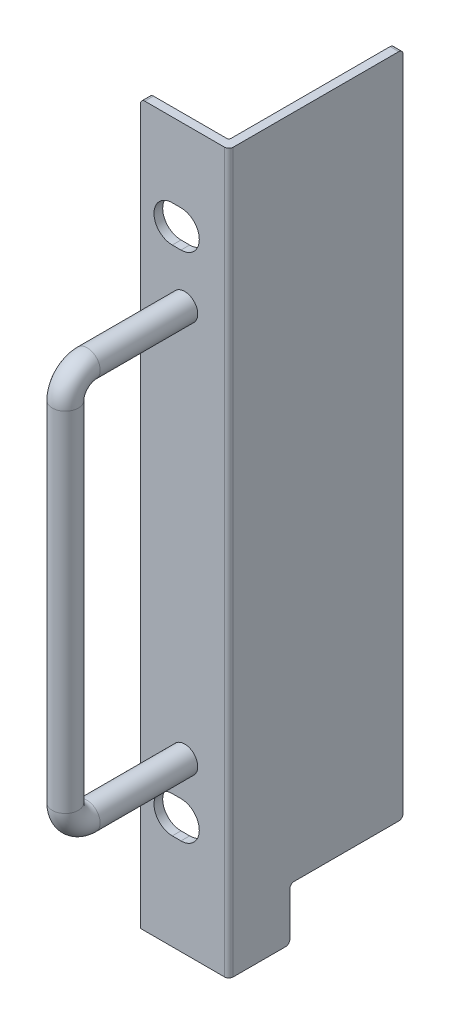
ISO-10303-21;
HEADER;
FILE_DESCRIPTION(('STEP AP214'),'2;1');
FILE_NAME('part.step','',(''),(''),'','','');
FILE_SCHEMA(('AUTOMOTIVE_DESIGN { 1 0 10303 214 1 1 1 1 }'));
ENDSEC;
DATA;
#1=APPLICATION_CONTEXT('core data for automotive mechanical design processes');
#2=APPLICATION_PROTOCOL_DEFINITION('international standard','automotive_design',2000,#1);
#3=PRODUCT_CONTEXT('',#1,'mechanical');
#4=PRODUCT('Part','Part','',(#3));
#5=PRODUCT_RELATED_PRODUCT_CATEGORY('part','',(#4));
#6=PRODUCT_DEFINITION_FORMATION('','',#4);
#7=PRODUCT_DEFINITION_CONTEXT('part definition',#1,'design');
#8=PRODUCT_DEFINITION('design','',#6,#7);
#9=PRODUCT_DEFINITION_SHAPE('','',#8);
#10=(LENGTH_UNIT() NAMED_UNIT(*) SI_UNIT(.MILLI.,.METRE.));
#11=(NAMED_UNIT(*) PLANE_ANGLE_UNIT() SI_UNIT($,.RADIAN.));
#12=(NAMED_UNIT(*) SI_UNIT($,.STERADIAN.) SOLID_ANGLE_UNIT());
#13=UNCERTAINTY_MEASURE_WITH_UNIT(LENGTH_MEASURE(1.E-05),#10,'distance_accuracy_value','');
#14=(GEOMETRIC_REPRESENTATION_CONTEXT(3) GLOBAL_UNCERTAINTY_ASSIGNED_CONTEXT((#13)) GLOBAL_UNIT_ASSIGNED_CONTEXT((#10,
#11,#12)) REPRESENTATION_CONTEXT('',''));
#15=CARTESIAN_POINT('',(0.,0.,0.));
#16=DIRECTION('',(0.,0.,1.));
#17=DIRECTION('',(1.,0.,0.));
#18=AXIS2_PLACEMENT_3D('',#15,#16,#17);
#19=CARTESIAN_POINT('',(0.,165.,0.));
#20=DIRECTION('',(0.,0.,-1.));
#21=DIRECTION('',(1.,0.,0.));
#22=AXIS2_PLACEMENT_3D('',#19,#20,#21);
#23=PLANE('',#22);
#24=CARTESIAN_POINT('',(-10.15,128.745,0.));
#25=DIRECTION('',(0.,0.,-1.));
#26=DIRECTION('',(-1.,0.,0.));
#27=AXIS2_PLACEMENT_3D('',#24,#25,#26);
#28=CIRCLE('',#27,3.);
#29=CARTESIAN_POINT('',(-13.15,128.745,0.));
#30=VERTEX_POINT('',#29);
#31=EDGE_CURVE('E307',#30,#30,#28,.T.);
#32=ORIENTED_EDGE('',*,*,#31,.T.);
#33=EDGE_LOOP('',(#32));
#34=FACE_BOUND('',#33,.T.);
#35=DIRECTION('',(1.,0.,0.));
#36=VECTOR('',#35,1.);
#37=CARTESIAN_POINT('',(-13.,147.945,0.));
#38=LINE('',#37,#36);
#39=CARTESIAN_POINT('',(-13.,147.945,0.));
#40=VERTEX_POINT('',#39);
#41=CARTESIAN_POINT('',(-11.,147.945,0.));
#42=VERTEX_POINT('',#41);
#43=EDGE_CURVE('E196',#40,#42,#38,.T.);
#44=ORIENTED_EDGE('',*,*,#43,.T.);
#45=CARTESIAN_POINT('',(-11.,143.745,0.));
#46=DIRECTION('',(0.,0.,-1.));
#47=DIRECTION('',(-1.,0.,0.));
#48=AXIS2_PLACEMENT_3D('',#45,#46,#47);
#49=CIRCLE('',#48,4.19999999999998);
#50=CARTESIAN_POINT('',(-11.,139.545,0.));
#51=VERTEX_POINT('',#50);
#52=EDGE_CURVE('E206',#42,#51,#49,.T.);
#53=ORIENTED_EDGE('',*,*,#52,.T.);
#54=DIRECTION('',(-1.,0.,0.));
#55=VECTOR('',#54,1.);
#56=CARTESIAN_POINT('',(-13.,139.545,0.));
#57=LINE('',#56,#55);
#58=CARTESIAN_POINT('',(-13.,139.545,0.));
#59=VERTEX_POINT('',#58);
#60=EDGE_CURVE('E211',#51,#59,#57,.T.);
#61=ORIENTED_EDGE('',*,*,#60,.T.);
#62=CARTESIAN_POINT('',(-13.,143.745,0.));
#63=DIRECTION('',(0.,0.,-1.));
#64=DIRECTION('',(-1.,0.,0.));
#65=AXIS2_PLACEMENT_3D('',#62,#63,#64);
#66=CIRCLE('',#65,4.19999999999998);
#67=EDGE_CURVE('E216',#59,#40,#66,.T.);
#68=ORIENTED_EDGE('',*,*,#67,.T.);
#69=EDGE_LOOP('',(#44,#53,#61,#68));
#70=FACE_BOUND('',#69,.T.);
#71=DIRECTION('',(1.,0.,0.));
#72=VECTOR('',#71,1.);
#73=CARTESIAN_POINT('',(-13.,30.455,0.));
#74=LINE('',#73,#72);
#75=CARTESIAN_POINT('',(-13.,30.455,0.));
#76=VERTEX_POINT('',#75);
#77=CARTESIAN_POINT('',(-11.,30.455,0.));
#78=VERTEX_POINT('',#77);
#79=EDGE_CURVE('E231',#76,#78,#74,.T.);
#80=ORIENTED_EDGE('',*,*,#79,.T.);
#81=CARTESIAN_POINT('',(-11.,26.255,0.));
#82=DIRECTION('',(0.,0.,-1.));
#83=DIRECTION('',(1.,0.,0.));
#84=AXIS2_PLACEMENT_3D('',#81,#82,#83);
#85=CIRCLE('',#84,4.19999999999997);
#86=CARTESIAN_POINT('',(-11.,22.055,0.));
#87=VERTEX_POINT('',#86);
#88=EDGE_CURVE('E235',#78,#87,#85,.T.);
#89=ORIENTED_EDGE('',*,*,#88,.T.);
#90=DIRECTION('',(-1.,0.,0.));
#91=VECTOR('',#90,1.);
#92=CARTESIAN_POINT('',(-13.,22.055,0.));
#93=LINE('',#92,#91);
#94=CARTESIAN_POINT('',(-13.,22.055,0.));
#95=VERTEX_POINT('',#94);
#96=EDGE_CURVE('E238',#87,#95,#93,.T.);
#97=ORIENTED_EDGE('',*,*,#96,.T.);
#98=CARTESIAN_POINT('',(-13.,26.255,0.));
#99=DIRECTION('',(0.,0.,-1.));
#100=DIRECTION('',(1.,0.,0.));
#101=AXIS2_PLACEMENT_3D('',#98,#99,#100);
#102=CIRCLE('',#101,4.19999999999997);
#103=EDGE_CURVE('E228',#95,#76,#102,.T.);
#104=ORIENTED_EDGE('',*,*,#103,.T.);
#105=EDGE_LOOP('',(#80,#89,#97,#104));
#106=FACE_BOUND('',#105,.T.);
#107=DIRECTION('',(-1.,0.,0.));
#108=VECTOR('',#107,1.);
#109=CARTESIAN_POINT('',(0.,165.,0.));
#110=LINE('',#109,#108);
#111=CARTESIAN_POINT('',(-1.,165.,0.));
#112=VERTEX_POINT('',#111);
#113=CARTESIAN_POINT('',(-19.3,165.,0.));
#114=VERTEX_POINT('',#113);
#115=EDGE_CURVE('E248',#112,#114,#110,.T.);
#116=ORIENTED_EDGE('',*,*,#115,.T.);
#117=CARTESIAN_POINT('',(-19.3,164.,0.));
#118=DIRECTION('',(0.,0.,1.));
#119=DIRECTION('',(1.,0.,0.));
#120=AXIS2_PLACEMENT_3D('',#117,#118,#119);
#121=CIRCLE('',#120,1.);
#122=CARTESIAN_POINT('',(-20.3,164.,0.));
#123=VERTEX_POINT('',#122);
#124=EDGE_CURVE('E311',#123,#114,#121,.F.);
#125=ORIENTED_EDGE('',*,*,#124,.F.);
#126=DIRECTION('',(0.,-1.,0.));
#127=VECTOR('',#126,1.);
#128=CARTESIAN_POINT('',(-20.3,165.,0.));
#129=LINE('',#128,#127);
#130=CARTESIAN_POINT('',(-20.3,0.,0.));
#131=VERTEX_POINT('',#130);
#132=EDGE_CURVE('E283',#123,#131,#129,.T.);
#133=ORIENTED_EDGE('',*,*,#132,.T.);
#134=DIRECTION('',(-1.,0.,0.));
#135=VECTOR('',#134,1.);
#136=CARTESIAN_POINT('',(0.,0.,0.));
#137=LINE('',#136,#135);
#138=CARTESIAN_POINT('',(-1.,0.,0.));
#139=VERTEX_POINT('',#138);
#140=EDGE_CURVE('E225',#139,#131,#137,.T.);
#141=ORIENTED_EDGE('',*,*,#140,.F.);
#142=DIRECTION('',(0.,-1.,0.));
#143=VECTOR('',#142,1.);
#144=CARTESIAN_POINT('',(-1.,165.,0.));
#145=LINE('',#144,#143);
#146=EDGE_CURVE('E314',#112,#139,#145,.T.);
#147=ORIENTED_EDGE('',*,*,#146,.F.);
#148=EDGE_LOOP('',(#116,#125,#133,#141,#147));
#149=FACE_BOUND('',#148,.T.);
#150=CARTESIAN_POINT('',(-10.15,38.745,0.));
#151=DIRECTION('',(0.,0.,1.));
#152=DIRECTION('',(-1.,0.,0.));
#153=AXIS2_PLACEMENT_3D('',#150,#151,#152);
#154=CIRCLE('',#153,3.);
#155=CARTESIAN_POINT('',(-13.15,38.745,0.));
#156=VERTEX_POINT('',#155);
#157=EDGE_CURVE('E425',#156,#156,#154,.T.);
#158=ORIENTED_EDGE('',*,*,#157,.F.);
#159=EDGE_LOOP('',(#158));
#160=FACE_BOUND('',#159,.T.);
#161=ADVANCED_FACE('F39',(#34,#70,#106,#149,#160),#23,.F.);
#162=CARTESIAN_POINT('',(-20.3,165.,0.));
#163=DIRECTION('',(1.,0.,0.));
#164=DIRECTION('',(0.,0.,1.));
#165=AXIS2_PLACEMENT_3D('',#162,#163,#164);
#166=PLANE('',#165);
#167=DIRECTION('',(0.,-1.,0.));
#168=VECTOR('',#167,1.);
#169=CARTESIAN_POINT('',(-20.3,165.,-2.));
#170=LINE('',#169,#168);
#171=CARTESIAN_POINT('',(-20.3,164.,-2.));
#172=VERTEX_POINT('',#171);
#173=CARTESIAN_POINT('',(-20.3,0.,-2.));
#174=VERTEX_POINT('',#173);
#175=EDGE_CURVE('E280',#172,#174,#170,.T.);
#176=ORIENTED_EDGE('',*,*,#175,.T.);
#177=DIRECTION('',(0.,0.,-1.));
#178=VECTOR('',#177,1.);
#179=CARTESIAN_POINT('',(-20.3,0.,0.));
#180=LINE('',#179,#178);
#181=EDGE_CURVE('E264',#131,#174,#180,.T.);
#182=ORIENTED_EDGE('',*,*,#181,.F.);
#183=ORIENTED_EDGE('',*,*,#132,.F.);
#184=DIRECTION('',(0.,0.,-1.));
#185=VECTOR('',#184,1.);
#186=CARTESIAN_POINT('',(-20.3,164.,0.));
#187=LINE('',#186,#185);
#188=EDGE_CURVE('E340',#172,#123,#187,.F.);
#189=ORIENTED_EDGE('',*,*,#188,.F.);
#190=EDGE_LOOP('',(#176,#182,#183,#189));
#191=FACE_BOUND('',#190,.T.);
#192=ADVANCED_FACE('F414',(#191),#166,.F.);
#193=CARTESIAN_POINT('',(-2.,165.,-2.));
#194=DIRECTION('',(0.,0.,1.));
#195=DIRECTION('',(-1.,0.,0.));
#196=AXIS2_PLACEMENT_3D('',#193,#194,#195);
#197=PLANE('',#196);
#198=DIRECTION('',(-1.,0.,0.));
#199=VECTOR('',#198,1.);
#200=CARTESIAN_POINT('',(-2.,139.545,-2.));
#201=LINE('',#200,#199);
#202=CARTESIAN_POINT('',(-11.,139.545,-2.));
#203=VERTEX_POINT('',#202);
#204=CARTESIAN_POINT('',(-13.,139.545,-2.));
#205=VERTEX_POINT('',#204);
#206=EDGE_CURVE('E301',#203,#205,#201,.T.);
#207=ORIENTED_EDGE('',*,*,#206,.F.);
#208=CARTESIAN_POINT('',(-11.,143.745,-2.));
#209=DIRECTION('',(0.,0.,-1.));
#210=DIRECTION('',(-1.,0.,0.));
#211=AXIS2_PLACEMENT_3D('',#208,#209,#210);
#212=CIRCLE('',#211,4.19999999999998);
#213=CARTESIAN_POINT('',(-11.,147.945,-2.));
#214=VERTEX_POINT('',#213);
#215=EDGE_CURVE('E299',#214,#203,#212,.T.);
#216=ORIENTED_EDGE('',*,*,#215,.F.);
#217=DIRECTION('',(1.,0.,0.));
#218=VECTOR('',#217,1.);
#219=CARTESIAN_POINT('',(-2.,147.945,-2.));
#220=LINE('',#219,#218);
#221=CARTESIAN_POINT('',(-13.,147.945,-2.));
#222=VERTEX_POINT('',#221);
#223=EDGE_CURVE('E198',#222,#214,#220,.T.);
#224=ORIENTED_EDGE('',*,*,#223,.F.);
#225=CARTESIAN_POINT('',(-13.,143.745,-2.));
#226=DIRECTION('',(0.,0.,-1.));
#227=DIRECTION('',(-1.,0.,0.));
#228=AXIS2_PLACEMENT_3D('',#225,#226,#227);
#229=CIRCLE('',#228,4.19999999999998);
#230=EDGE_CURVE('E304',#205,#222,#229,.T.);
#231=ORIENTED_EDGE('',*,*,#230,.F.);
#232=EDGE_LOOP('',(#207,#216,#224,#231));
#233=FACE_BOUND('',#232,.T.);
#234=DIRECTION('',(-1.,0.,0.));
#235=VECTOR('',#234,1.);
#236=CARTESIAN_POINT('',(-2.,22.055,-2.));
#237=LINE('',#236,#235);
#238=CARTESIAN_POINT('',(-11.,22.055,-2.));
#239=VERTEX_POINT('',#238);
#240=CARTESIAN_POINT('',(-13.,22.055,-2.));
#241=VERTEX_POINT('',#240);
#242=EDGE_CURVE('E292',#239,#241,#237,.T.);
#243=ORIENTED_EDGE('',*,*,#242,.F.);
#244=CARTESIAN_POINT('',(-11.,26.255,-2.));
#245=DIRECTION('',(0.,0.,-1.));
#246=DIRECTION('',(-1.,0.,0.));
#247=AXIS2_PLACEMENT_3D('',#244,#245,#246);
#248=CIRCLE('',#247,4.19999999999997);
#249=CARTESIAN_POINT('',(-11.,30.455,-2.));
#250=VERTEX_POINT('',#249);
#251=EDGE_CURVE('E289',#250,#239,#248,.T.);
#252=ORIENTED_EDGE('',*,*,#251,.F.);
#253=DIRECTION('',(1.,0.,0.));
#254=VECTOR('',#253,1.);
#255=CARTESIAN_POINT('',(-2.,30.455,-2.));
#256=LINE('',#255,#254);
#257=CARTESIAN_POINT('',(-13.,30.455,-2.));
#258=VERTEX_POINT('',#257);
#259=EDGE_CURVE('E286',#258,#250,#256,.T.);
#260=ORIENTED_EDGE('',*,*,#259,.F.);
#261=CARTESIAN_POINT('',(-13.,26.255,-2.));
#262=DIRECTION('',(0.,0.,-1.));
#263=DIRECTION('',(-1.,0.,0.));
#264=AXIS2_PLACEMENT_3D('',#261,#262,#263);
#265=CIRCLE('',#264,4.19999999999997);
#266=EDGE_CURVE('E295',#241,#258,#265,.T.);
#267=ORIENTED_EDGE('',*,*,#266,.F.);
#268=EDGE_LOOP('',(#243,#252,#260,#267));
#269=FACE_BOUND('',#268,.T.);
#270=DIRECTION('',(1.,0.,0.));
#271=VECTOR('',#270,1.);
#272=CARTESIAN_POINT('',(-2.,0.,-2.));
#273=LINE('',#272,#271);
#274=CARTESIAN_POINT('',(-2.5,0.,-2.));
#275=VERTEX_POINT('',#274);
#276=EDGE_CURVE('E267',#174,#275,#273,.T.);
#277=ORIENTED_EDGE('',*,*,#276,.F.);
#278=ORIENTED_EDGE('',*,*,#175,.F.);
#279=CARTESIAN_POINT('',(-19.3,164.,-2.));
#280=DIRECTION('',(0.,0.,-1.));
#281=DIRECTION('',(-1.,0.,0.));
#282=AXIS2_PLACEMENT_3D('',#279,#280,#281);
#283=CIRCLE('',#282,1.);
#284=CARTESIAN_POINT('',(-19.3,165.,-2.));
#285=VERTEX_POINT('',#284);
#286=EDGE_CURVE('E338',#285,#172,#283,.F.);
#287=ORIENTED_EDGE('',*,*,#286,.F.);
#288=DIRECTION('',(1.,0.,0.));
#289=VECTOR('',#288,1.);
#290=CARTESIAN_POINT('',(-2.,165.,-2.));
#291=LINE('',#290,#289);
#292=CARTESIAN_POINT('',(-2.5,165.,-2.));
#293=VERTEX_POINT('',#292);
#294=EDGE_CURVE('E251',#285,#293,#291,.T.);
#295=ORIENTED_EDGE('',*,*,#294,.T.);
#296=DIRECTION('',(0.,-1.,0.));
#297=VECTOR('',#296,1.);
#298=CARTESIAN_POINT('',(-2.5,165.,-2.));
#299=LINE('',#298,#297);
#300=EDGE_CURVE('E372',#275,#293,#299,.F.);
#301=ORIENTED_EDGE('',*,*,#300,.F.);
#302=EDGE_LOOP('',(#277,#278,#287,#295,#301));
#303=FACE_BOUND('',#302,.T.);
#304=ADVANCED_FACE('F376',(#233,#269,#303),#197,.F.);
#305=CARTESIAN_POINT('',(-2.,165.,-2.));
#306=DIRECTION('',(1.,0.,0.));
#307=DIRECTION('',(0.,0.,1.));
#308=AXIS2_PLACEMENT_3D('',#305,#306,#307);
#309=PLANE('',#308);
#310=DIRECTION('',(0.,0.,-1.));
#311=VECTOR('',#310,1.);
#312=CARTESIAN_POINT('',(-2.,165.,-2.));
#313=LINE('',#312,#311);
#314=CARTESIAN_POINT('',(-2.,165.,-2.5));
#315=VERTEX_POINT('',#314);
#316=CARTESIAN_POINT('',(-2.,165.,-39.));
#317=VERTEX_POINT('',#316);
#318=EDGE_CURVE('E255',#315,#317,#313,.T.);
#319=ORIENTED_EDGE('',*,*,#318,.T.);
#320=CARTESIAN_POINT('',(-2.,164.,-39.));
#321=DIRECTION('',(-1.,0.,0.));
#322=DIRECTION('',(0.,0.,1.));
#323=AXIS2_PLACEMENT_3D('',#320,#321,#322);
#324=CIRCLE('',#323,1.);
#325=CARTESIAN_POINT('',(-2.,164.,-40.));
#326=VERTEX_POINT('',#325);
#327=EDGE_CURVE('E353',#326,#317,#324,.F.);
#328=ORIENTED_EDGE('',*,*,#327,.F.);
#329=DIRECTION('',(0.,-1.,0.));
#330=VECTOR('',#329,1.);
#331=CARTESIAN_POINT('',(-2.,165.,-40.));
#332=LINE('',#331,#330);
#333=CARTESIAN_POINT('',(-2.,13.,-40.));
#334=VERTEX_POINT('',#333);
#335=EDGE_CURVE('E277',#326,#334,#332,.T.);
#336=ORIENTED_EDGE('',*,*,#335,.T.);
#337=CARTESIAN_POINT('',(-2.,13.,-39.));
#338=DIRECTION('',(-1.,0.,0.));
#339=DIRECTION('',(0.,0.,1.));
#340=AXIS2_PLACEMENT_3D('',#337,#338,#339);
#341=CIRCLE('',#340,1.);
#342=CARTESIAN_POINT('',(-2.,12.,-39.));
#343=VERTEX_POINT('',#342);
#344=EDGE_CURVE('E350',#343,#334,#341,.F.);
#345=ORIENTED_EDGE('',*,*,#344,.F.);
#346=DIRECTION('',(0.,0.,1.));
#347=VECTOR('',#346,1.);
#348=CARTESIAN_POINT('',(-2.,12.,-40.));
#349=LINE('',#348,#347);
#350=CARTESIAN_POINT('',(-2.,12.,-15.));
#351=VERTEX_POINT('',#350);
#352=EDGE_CURVE('E431',#343,#351,#349,.T.);
#353=ORIENTED_EDGE('',*,*,#352,.T.);
#354=CARTESIAN_POINT('',(-2.,11.,-15.));
#355=DIRECTION('',(-1.,0.,0.));
#356=DIRECTION('',(0.,0.,1.));
#357=AXIS2_PLACEMENT_3D('',#354,#355,#356);
#358=CIRCLE('',#357,1.);
#359=CARTESIAN_POINT('',(-2.,11.,-14.));
#360=VERTEX_POINT('',#359);
#361=EDGE_CURVE('E364',#360,#351,#358,.T.);
#362=ORIENTED_EDGE('',*,*,#361,.F.);
#363=DIRECTION('',(0.,-1.,0.));
#364=VECTOR('',#363,1.);
#365=CARTESIAN_POINT('',(-2.,0.,-14.));
#366=LINE('',#365,#364);
#367=CARTESIAN_POINT('',(-2.,1.,-14.));
#368=VERTEX_POINT('',#367);
#369=EDGE_CURVE('E426',#360,#368,#366,.T.);
#370=ORIENTED_EDGE('',*,*,#369,.T.);
#371=CARTESIAN_POINT('',(-2.,1.,-13.));
#372=DIRECTION('',(-1.,0.,0.));
#373=DIRECTION('',(0.,0.,1.));
#374=AXIS2_PLACEMENT_3D('',#371,#372,#373);
#375=CIRCLE('',#374,1.);
#376=CARTESIAN_POINT('',(-2.,0.,-13.));
#377=VERTEX_POINT('',#376);
#378=EDGE_CURVE('E347',#377,#368,#375,.F.);
#379=ORIENTED_EDGE('',*,*,#378,.F.);
#380=DIRECTION('',(0.,0.,-1.));
#381=VECTOR('',#380,1.);
#382=CARTESIAN_POINT('',(-2.,0.,-2.));
#383=LINE('',#382,#381);
#384=CARTESIAN_POINT('',(-2.,0.,-2.5));
#385=VERTEX_POINT('',#384);
#386=EDGE_CURVE('E270',#385,#377,#383,.T.);
#387=ORIENTED_EDGE('',*,*,#386,.F.);
#388=DIRECTION('',(0.,-1.,0.));
#389=VECTOR('',#388,1.);
#390=CARTESIAN_POINT('',(-2.,0.,-2.5));
#391=LINE('',#390,#389);
#392=EDGE_CURVE('E370',#315,#385,#391,.T.);
#393=ORIENTED_EDGE('',*,*,#392,.F.);
#394=EDGE_LOOP('',(#319,#328,#336,#345,#353,#362,#370,#379,#387,#393));
#395=FACE_BOUND('',#394,.T.);
#396=ADVANCED_FACE('F407',(#395),#309,.F.);
#397=CARTESIAN_POINT('',(0.,165.,-40.));
#398=DIRECTION('',(0.,0.,1.));
#399=DIRECTION('',(-1.,0.,0.));
#400=AXIS2_PLACEMENT_3D('',#397,#398,#399);
#401=PLANE('',#400);
#402=DIRECTION('',(0.,-1.,0.));
#403=VECTOR('',#402,1.);
#404=CARTESIAN_POINT('',(0.,165.,-40.));
#405=LINE('',#404,#403);
#406=CARTESIAN_POINT('',(0.,164.,-40.));
#407=VERTEX_POINT('',#406);
#408=CARTESIAN_POINT('',(0.,13.,-40.));
#409=VERTEX_POINT('',#408);
#410=EDGE_CURVE('E261',#407,#409,#405,.T.);
#411=ORIENTED_EDGE('',*,*,#410,.T.);
#412=DIRECTION('',(-1.,0.,0.));
#413=VECTOR('',#412,1.);
#414=CARTESIAN_POINT('',(0.,13.,-40.));
#415=LINE('',#414,#413);
#416=EDGE_CURVE('E342',#334,#409,#415,.F.);
#417=ORIENTED_EDGE('',*,*,#416,.F.);
#418=ORIENTED_EDGE('',*,*,#335,.F.);
#419=DIRECTION('',(1.,0.,0.));
#420=VECTOR('',#419,1.);
#421=CARTESIAN_POINT('',(-2.,164.,-40.));
#422=LINE('',#421,#420);
#423=EDGE_CURVE('E345',#407,#326,#422,.F.);
#424=ORIENTED_EDGE('',*,*,#423,.F.);
#425=EDGE_LOOP('',(#411,#417,#418,#424));
#426=FACE_BOUND('',#425,.T.);
#427=ADVANCED_FACE('F403',(#426),#401,.F.);
#428=CARTESIAN_POINT('',(0.,165.,0.));
#429=DIRECTION('',(-1.,0.,0.));
#430=DIRECTION('',(0.,0.,-1.));
#431=AXIS2_PLACEMENT_3D('',#428,#429,#430);
#432=PLANE('',#431);
#433=DIRECTION('',(0.,0.,1.));
#434=VECTOR('',#433,1.);
#435=CARTESIAN_POINT('',(0.,0.,0.));
#436=LINE('',#435,#434);
#437=CARTESIAN_POINT('',(0.,0.,-13.));
#438=VERTEX_POINT('',#437);
#439=CARTESIAN_POINT('',(0.,0.,-1.));
#440=VERTEX_POINT('',#439);
#441=EDGE_CURVE('E252',#438,#440,#436,.T.);
#442=ORIENTED_EDGE('',*,*,#441,.F.);
#443=CARTESIAN_POINT('',(0.,1.,-13.));
#444=DIRECTION('',(1.,0.,0.));
#445=DIRECTION('',(0.,0.,-1.));
#446=AXIS2_PLACEMENT_3D('',#443,#444,#445);
#447=CIRCLE('',#446,1.);
#448=CARTESIAN_POINT('',(0.,1.,-14.));
#449=VERTEX_POINT('',#448);
#450=EDGE_CURVE('E321',#449,#438,#447,.F.);
#451=ORIENTED_EDGE('',*,*,#450,.F.);
#452=DIRECTION('',(0.,-1.,0.));
#453=VECTOR('',#452,1.);
#454=CARTESIAN_POINT('',(0.,165.,-14.));
#455=LINE('',#454,#453);
#456=CARTESIAN_POINT('',(0.,11.,-14.));
#457=VERTEX_POINT('',#456);
#458=EDGE_CURVE('E419',#457,#449,#455,.T.);
#459=ORIENTED_EDGE('',*,*,#458,.F.);
#460=CARTESIAN_POINT('',(0.,11.,-15.));
#461=DIRECTION('',(1.,0.,0.));
#462=DIRECTION('',(0.,0.,-1.));
#463=AXIS2_PLACEMENT_3D('',#460,#461,#462);
#464=CIRCLE('',#463,1.);
#465=CARTESIAN_POINT('',(0.,12.,-15.));
#466=VERTEX_POINT('',#465);
#467=EDGE_CURVE('E367',#466,#457,#464,.T.);
#468=ORIENTED_EDGE('',*,*,#467,.F.);
#469=DIRECTION('',(0.,0.,1.));
#470=VECTOR('',#469,1.);
#471=CARTESIAN_POINT('',(0.,12.,0.));
#472=LINE('',#471,#470);
#473=CARTESIAN_POINT('',(0.,12.,-39.));
#474=VERTEX_POINT('',#473);
#475=EDGE_CURVE('E308',#474,#466,#472,.T.);
#476=ORIENTED_EDGE('',*,*,#475,.F.);
#477=CARTESIAN_POINT('',(0.,13.,-39.));
#478=DIRECTION('',(1.,0.,0.));
#479=DIRECTION('',(0.,0.,-1.));
#480=AXIS2_PLACEMENT_3D('',#477,#478,#479);
#481=CIRCLE('',#480,1.);
#482=EDGE_CURVE('E324',#409,#474,#481,.F.);
#483=ORIENTED_EDGE('',*,*,#482,.F.);
#484=ORIENTED_EDGE('',*,*,#410,.F.);
#485=CARTESIAN_POINT('',(0.,164.,-39.));
#486=DIRECTION('',(1.,0.,0.));
#487=DIRECTION('',(0.,0.,-1.));
#488=AXIS2_PLACEMENT_3D('',#485,#486,#487);
#489=CIRCLE('',#488,1.);
#490=CARTESIAN_POINT('',(0.,165.,-39.));
#491=VERTEX_POINT('',#490);
#492=EDGE_CURVE('E327',#491,#407,#489,.F.);
#493=ORIENTED_EDGE('',*,*,#492,.F.);
#494=DIRECTION('',(0.,0.,1.));
#495=VECTOR('',#494,1.);
#496=CARTESIAN_POINT('',(0.,165.,0.));
#497=LINE('',#496,#495);
#498=CARTESIAN_POINT('',(0.,165.,-1.));
#499=VERTEX_POINT('',#498);
#500=EDGE_CURVE('E258',#491,#499,#497,.T.);
#501=ORIENTED_EDGE('',*,*,#500,.T.);
#502=DIRECTION('',(0.,-1.,0.));
#503=VECTOR('',#502,1.);
#504=CARTESIAN_POINT('',(0.,165.,-1.));
#505=LINE('',#504,#503);
#506=EDGE_CURVE('E329',#440,#499,#505,.F.);
#507=ORIENTED_EDGE('',*,*,#506,.F.);
#508=EDGE_LOOP('',(#442,#451,#459,#468,#476,#483,#484,#493,#501,#507));
#509=FACE_BOUND('',#508,.T.);
#510=ADVANCED_FACE('F397',(#509),#432,.F.);
#511=CARTESIAN_POINT('',(0.,165.,0.));
#512=DIRECTION('',(0.,1.,0.));
#513=DIRECTION('',(0.,0.,1.));
#514=AXIS2_PLACEMENT_3D('',#511,#512,#513);
#515=PLANE('',#514);
#516=ORIENTED_EDGE('',*,*,#500,.F.);
#517=DIRECTION('',(1.,0.,0.));
#518=VECTOR('',#517,1.);
#519=CARTESIAN_POINT('',(0.,165.,-39.));
#520=LINE('',#519,#518);
#521=EDGE_CURVE('E332',#317,#491,#520,.T.);
#522=ORIENTED_EDGE('',*,*,#521,.F.);
#523=ORIENTED_EDGE('',*,*,#318,.F.);
#524=CARTESIAN_POINT('',(-2.5,165.,-2.5));
#525=DIRECTION('',(0.,-1.,0.));
#526=DIRECTION('',(0.,0.,1.));
#527=AXIS2_PLACEMENT_3D('',#524,#525,#526);
#528=CIRCLE('',#527,0.5);
#529=EDGE_CURVE('E11',#293,#315,#528,.F.);
#530=ORIENTED_EDGE('',*,*,#529,.F.);
#531=ORIENTED_EDGE('',*,*,#294,.F.);
#532=DIRECTION('',(0.,0.,-1.));
#533=VECTOR('',#532,1.);
#534=CARTESIAN_POINT('',(-19.3,165.,-2.));
#535=LINE('',#534,#533);
#536=EDGE_CURVE('E334',#114,#285,#535,.T.);
#537=ORIENTED_EDGE('',*,*,#536,.F.);
#538=ORIENTED_EDGE('',*,*,#115,.F.);
#539=CARTESIAN_POINT('',(-1.,165.,-1.));
#540=DIRECTION('',(0.,-1.,0.));
#541=DIRECTION('',(0.,0.,1.));
#542=AXIS2_PLACEMENT_3D('',#539,#540,#541);
#543=CIRCLE('',#542,1.);
#544=EDGE_CURVE('E336',#499,#112,#543,.T.);
#545=ORIENTED_EDGE('',*,*,#544,.F.);
#546=EDGE_LOOP('',(#516,#522,#523,#530,#531,#537,#538,#545));
#547=FACE_BOUND('',#546,.T.);
#548=ADVANCED_FACE('F379',(#547),#515,.T.);
#549=CARTESIAN_POINT('',(0.,0.,0.));
#550=DIRECTION('',(0.,1.,0.));
#551=DIRECTION('',(0.,0.,1.));
#552=AXIS2_PLACEMENT_3D('',#549,#550,#551);
#553=PLANE('',#552);
#554=ORIENTED_EDGE('',*,*,#140,.T.);
#555=ORIENTED_EDGE('',*,*,#181,.T.);
#556=ORIENTED_EDGE('',*,*,#276,.T.);
#557=CARTESIAN_POINT('',(-2.5,0.,-2.5));
#558=DIRECTION('',(0.,-1.,0.));
#559=DIRECTION('',(0.,0.,1.));
#560=AXIS2_PLACEMENT_3D('',#557,#558,#559);
#561=CIRCLE('',#560,0.5);
#562=EDGE_CURVE('E47',#385,#275,#561,.T.);
#563=ORIENTED_EDGE('',*,*,#562,.F.);
#564=ORIENTED_EDGE('',*,*,#386,.T.);
#565=DIRECTION('',(-1.,0.,0.));
#566=VECTOR('',#565,1.);
#567=CARTESIAN_POINT('',(0.,0.,-13.));
#568=LINE('',#567,#566);
#569=EDGE_CURVE('E317',#438,#377,#568,.T.);
#570=ORIENTED_EDGE('',*,*,#569,.F.);
#571=ORIENTED_EDGE('',*,*,#441,.T.);
#572=CARTESIAN_POINT('',(-1.,0.,-1.));
#573=DIRECTION('',(0.,-1.,0.));
#574=DIRECTION('',(0.,0.,1.));
#575=AXIS2_PLACEMENT_3D('',#572,#573,#574);
#576=CIRCLE('',#575,1.);
#577=EDGE_CURVE('E319',#139,#440,#576,.F.);
#578=ORIENTED_EDGE('',*,*,#577,.F.);
#579=EDGE_LOOP('',(#554,#555,#556,#563,#564,#570,#571,#578));
#580=FACE_BOUND('',#579,.T.);
#581=ADVANCED_FACE('F412',(#580),#553,.F.);
#582=CARTESIAN_POINT('',(-13.,26.255,-132.));
#583=DIRECTION('',(0.,0.,1.));
#584=DIRECTION('',(-1.,0.,0.));
#585=AXIS2_PLACEMENT_3D('',#582,#583,#584);
#586=CYLINDRICAL_SURFACE('',#585,4.19999999999997);
#587=DIRECTION('',(0.,0.,1.));
#588=VECTOR('',#587,1.);
#589=CARTESIAN_POINT('',(-13.,22.055,-132.));
#590=LINE('',#589,#588);
#591=EDGE_CURVE('E218',#241,#95,#590,.T.);
#592=ORIENTED_EDGE('',*,*,#591,.F.);
#593=ORIENTED_EDGE('',*,*,#266,.T.);
#594=DIRECTION('',(0.,0.,1.));
#595=VECTOR('',#594,1.);
#596=CARTESIAN_POINT('',(-13.,30.455,-132.));
#597=LINE('',#596,#595);
#598=EDGE_CURVE('E241',#258,#76,#597,.T.);
#599=ORIENTED_EDGE('',*,*,#598,.T.);
#600=ORIENTED_EDGE('',*,*,#103,.F.);
#601=EDGE_LOOP('',(#592,#593,#599,#600));
#602=FACE_BOUND('',#601,.T.);
#603=ADVANCED_FACE('F591',(#602),#586,.F.);
#604=CARTESIAN_POINT('',(-13.,22.055,-132.));
#605=DIRECTION('',(0.,-1.,0.));
#606=DIRECTION('',(0.,0.,-1.));
#607=AXIS2_PLACEMENT_3D('',#604,#605,#606);
#608=PLANE('',#607);
#609=DIRECTION('',(0.,0.,1.));
#610=VECTOR('',#609,1.);
#611=CARTESIAN_POINT('',(-11.,22.055,-132.));
#612=LINE('',#611,#610);
#613=EDGE_CURVE('E243',#239,#87,#612,.T.);
#614=ORIENTED_EDGE('',*,*,#613,.F.);
#615=ORIENTED_EDGE('',*,*,#242,.T.);
#616=ORIENTED_EDGE('',*,*,#591,.T.);
#617=ORIENTED_EDGE('',*,*,#96,.F.);
#618=EDGE_LOOP('',(#614,#615,#616,#617));
#619=FACE_BOUND('',#618,.T.);
#620=ADVANCED_FACE('F600',(#619),#608,.F.);
#621=CARTESIAN_POINT('',(-11.,26.255,-132.));
#622=DIRECTION('',(0.,0.,1.));
#623=DIRECTION('',(-1.,0.,0.));
#624=AXIS2_PLACEMENT_3D('',#621,#622,#623);
#625=CYLINDRICAL_SURFACE('',#624,4.19999999999997);
#626=DIRECTION('',(0.,0.,1.));
#627=VECTOR('',#626,1.);
#628=CARTESIAN_POINT('',(-11.,30.455,-132.));
#629=LINE('',#628,#627);
#630=EDGE_CURVE('E245',#250,#78,#629,.T.);
#631=ORIENTED_EDGE('',*,*,#630,.F.);
#632=ORIENTED_EDGE('',*,*,#251,.T.);
#633=ORIENTED_EDGE('',*,*,#613,.T.);
#634=ORIENTED_EDGE('',*,*,#88,.F.);
#635=EDGE_LOOP('',(#631,#632,#633,#634));
#636=FACE_BOUND('',#635,.T.);
#637=ADVANCED_FACE('F609',(#636),#625,.F.);
#638=CARTESIAN_POINT('',(-13.,30.455,-132.));
#639=DIRECTION('',(0.,1.,0.));
#640=DIRECTION('',(0.,0.,1.));
#641=AXIS2_PLACEMENT_3D('',#638,#639,#640);
#642=PLANE('',#641);
#643=ORIENTED_EDGE('',*,*,#598,.F.);
#644=ORIENTED_EDGE('',*,*,#259,.T.);
#645=ORIENTED_EDGE('',*,*,#630,.T.);
#646=ORIENTED_EDGE('',*,*,#79,.F.);
#647=EDGE_LOOP('',(#643,#644,#645,#646));
#648=FACE_BOUND('',#647,.T.);
#649=ADVANCED_FACE('F618',(#648),#642,.F.);
#650=CARTESIAN_POINT('',(-13.,143.745,-132.));
#651=DIRECTION('',(0.,0.,1.));
#652=DIRECTION('',(-1.,0.,0.));
#653=AXIS2_PLACEMENT_3D('',#650,#651,#652);
#654=CYLINDRICAL_SURFACE('',#653,4.19999999999998);
#655=DIRECTION('',(0.,0.,1.));
#656=VECTOR('',#655,1.);
#657=CARTESIAN_POINT('',(-13.,139.545,-132.));
#658=LINE('',#657,#656);
#659=EDGE_CURVE('E223',#205,#59,#658,.T.);
#660=ORIENTED_EDGE('',*,*,#659,.F.);
#661=ORIENTED_EDGE('',*,*,#230,.T.);
#662=DIRECTION('',(0.,0.,1.));
#663=VECTOR('',#662,1.);
#664=CARTESIAN_POINT('',(-13.,147.945,-132.));
#665=LINE('',#664,#663);
#666=EDGE_CURVE('E203',#222,#40,#665,.T.);
#667=ORIENTED_EDGE('',*,*,#666,.T.);
#668=ORIENTED_EDGE('',*,*,#67,.F.);
#669=EDGE_LOOP('',(#660,#661,#667,#668));
#670=FACE_BOUND('',#669,.T.);
#671=ADVANCED_FACE('F627',(#670),#654,.F.);
#672=CARTESIAN_POINT('',(-13.,139.545,-132.));
#673=DIRECTION('',(0.,-1.,0.));
#674=DIRECTION('',(0.,0.,-1.));
#675=AXIS2_PLACEMENT_3D('',#672,#673,#674);
#676=PLANE('',#675);
#677=DIRECTION('',(0.,0.,1.));
#678=VECTOR('',#677,1.);
#679=CARTESIAN_POINT('',(-11.,139.545,-132.));
#680=LINE('',#679,#678);
#681=EDGE_CURVE('E202',#203,#51,#680,.T.);
#682=ORIENTED_EDGE('',*,*,#681,.F.);
#683=ORIENTED_EDGE('',*,*,#206,.T.);
#684=ORIENTED_EDGE('',*,*,#659,.T.);
#685=ORIENTED_EDGE('',*,*,#60,.F.);
#686=EDGE_LOOP('',(#682,#683,#684,#685));
#687=FACE_BOUND('',#686,.T.);
#688=ADVANCED_FACE('F636',(#687),#676,.F.);
#689=CARTESIAN_POINT('',(-11.,143.745,-132.));
#690=DIRECTION('',(0.,0.,1.));
#691=DIRECTION('',(-1.,0.,0.));
#692=AXIS2_PLACEMENT_3D('',#689,#690,#691);
#693=CYLINDRICAL_SURFACE('',#692,4.19999999999998);
#694=DIRECTION('',(0.,0.,1.));
#695=VECTOR('',#694,1.);
#696=CARTESIAN_POINT('',(-11.,147.945,-132.));
#697=LINE('',#696,#695);
#698=EDGE_CURVE('E192',#214,#42,#697,.T.);
#699=ORIENTED_EDGE('',*,*,#698,.F.);
#700=ORIENTED_EDGE('',*,*,#215,.T.);
#701=ORIENTED_EDGE('',*,*,#681,.T.);
#702=ORIENTED_EDGE('',*,*,#52,.F.);
#703=EDGE_LOOP('',(#699,#700,#701,#702));
#704=FACE_BOUND('',#703,.T.);
#705=ADVANCED_FACE('F207',(#704),#693,.F.);
#706=CARTESIAN_POINT('',(-13.,147.945,-132.));
#707=DIRECTION('',(0.,1.,0.));
#708=DIRECTION('',(0.,0.,1.));
#709=AXIS2_PLACEMENT_3D('',#706,#707,#708);
#710=PLANE('',#709);
#711=ORIENTED_EDGE('',*,*,#666,.F.);
#712=ORIENTED_EDGE('',*,*,#223,.T.);
#713=ORIENTED_EDGE('',*,*,#698,.T.);
#714=ORIENTED_EDGE('',*,*,#43,.F.);
#715=EDGE_LOOP('',(#711,#712,#713,#714));
#716=FACE_BOUND('',#715,.T.);
#717=ADVANCED_FACE('F194',(#716),#710,.F.);
#718=CARTESIAN_POINT('',(-10.15,38.745,0.));
#719=DIRECTION('',(0.,0.,1.));
#720=DIRECTION('',(-1.,0.,0.));
#721=AXIS2_PLACEMENT_3D('',#718,#719,#720);
#722=CYLINDRICAL_SURFACE('',#721,3.);
#723=CARTESIAN_POINT('',(-10.15,38.745,22.4));
#724=DIRECTION('',(0.,0.,1.));
#725=DIRECTION('',(-1.,0.,0.));
#726=AXIS2_PLACEMENT_3D('',#723,#724,#725);
#727=CIRCLE('',#726,3.);
#728=CARTESIAN_POINT('',(-10.15,35.745,22.4));
#729=VERTEX_POINT('',#728);
#730=EDGE_CURVE('E429',#729,#729,#727,.T.);
#731=ORIENTED_EDGE('',*,*,#730,.F.);
#732=EDGE_LOOP('',(#731));
#733=FACE_BOUND('',#732,.T.);
#734=ORIENTED_EDGE('',*,*,#157,.T.);
#735=EDGE_LOOP('',(#734));
#736=FACE_BOUND('',#735,.T.);
#737=ADVANCED_FACE('F470',(#733,#736),#722,.T.);
#738=CARTESIAN_POINT('',(-10.15,43.745,22.4));
#739=DIRECTION('',(1.,0.,0.));
#740=DIRECTION('',(0.,0.,1.));
#741=AXIS2_PLACEMENT_3D('',#738,#739,#740);
#742=TOROIDAL_SURFACE('',#741,4.99999999999996,3.);
#743=CARTESIAN_POINT('',(-10.15,43.745,27.4));
#744=DIRECTION('',(0.,1.,0.));
#745=DIRECTION('',(-1.,0.,0.));
#746=AXIS2_PLACEMENT_3D('',#743,#744,#745);
#747=CIRCLE('',#746,3.);
#748=CARTESIAN_POINT('',(-10.15,43.745,30.4));
#749=VERTEX_POINT('',#748);
#750=EDGE_CURVE('E437',#749,#749,#747,.T.);
#751=CARTESIAN_POINT('',(-10.15,43.745,22.4));
#752=DIRECTION('',(1.,0.,0.));
#753=DIRECTION('',(0.,0.,1.));
#754=AXIS2_PLACEMENT_3D('',#751,#752,#753);
#755=CIRCLE('',#754,7.99999999999997);
#756=EDGE_CURVE('',#749,#729,#755,.T.);
#757=ORIENTED_EDGE('',*,*,#750,.F.);
#758=ORIENTED_EDGE('',*,*,#730,.T.);
#759=ORIENTED_EDGE('',*,*,#756,.T.);
#760=ORIENTED_EDGE('',*,*,#756,.F.);
#761=EDGE_LOOP('',(#757,#759,#758,#760));
#762=FACE_BOUND('',#761,.T.);
#763=ADVANCED_FACE('F464',(#762),#742,.T.);
#764=CARTESIAN_POINT('',(-10.15,43.745,27.4));
#765=DIRECTION('',(0.,1.,0.));
#766=DIRECTION('',(0.,0.,1.));
#767=AXIS2_PLACEMENT_3D('',#764,#765,#766);
#768=CYLINDRICAL_SURFACE('',#767,3.);
#769=CARTESIAN_POINT('',(-10.15,123.745,27.4));
#770=DIRECTION('',(0.,1.,0.));
#771=DIRECTION('',(-1.,0.,0.));
#772=AXIS2_PLACEMENT_3D('',#769,#770,#771);
#773=CIRCLE('',#772,3.);
#774=CARTESIAN_POINT('',(-10.15,123.745,30.4));
#775=VERTEX_POINT('',#774);
#776=EDGE_CURVE('E440',#775,#775,#773,.T.);
#777=ORIENTED_EDGE('',*,*,#776,.F.);
#778=EDGE_LOOP('',(#777));
#779=FACE_BOUND('',#778,.T.);
#780=ORIENTED_EDGE('',*,*,#750,.T.);
#781=EDGE_LOOP('',(#780));
#782=FACE_BOUND('',#781,.T.);
#783=ADVANCED_FACE('F458',(#779,#782),#768,.T.);
#784=CARTESIAN_POINT('',(-10.15,123.745,22.4));
#785=DIRECTION('',(1.,0.,0.));
#786=DIRECTION('',(0.,0.,1.));
#787=AXIS2_PLACEMENT_3D('',#784,#785,#786);
#788=TOROIDAL_SURFACE('',#787,4.99999999999998,3.);
#789=CARTESIAN_POINT('',(-10.15,128.745,22.4));
#790=DIRECTION('',(0.,0.,-1.));
#791=DIRECTION('',(-1.,0.,0.));
#792=AXIS2_PLACEMENT_3D('',#789,#790,#791);
#793=CIRCLE('',#792,3.);
#794=CARTESIAN_POINT('',(-10.15,131.745,22.4));
#795=VERTEX_POINT('',#794);
#796=EDGE_CURVE('E232',#795,#795,#793,.T.);
#797=CARTESIAN_POINT('',(-10.15,123.745,22.4));
#798=DIRECTION('',(1.,0.,0.));
#799=DIRECTION('',(0.,0.,1.));
#800=AXIS2_PLACEMENT_3D('',#797,#798,#799);
#801=CIRCLE('',#800,7.99999999999998);
#802=EDGE_CURVE('',#795,#775,#801,.T.);
#803=ORIENTED_EDGE('',*,*,#796,.F.);
#804=ORIENTED_EDGE('',*,*,#776,.T.);
#805=ORIENTED_EDGE('',*,*,#802,.T.);
#806=ORIENTED_EDGE('',*,*,#802,.F.);
#807=EDGE_LOOP('',(#803,#805,#804,#806));
#808=FACE_BOUND('',#807,.T.);
#809=ADVANCED_FACE('F452',(#808),#788,.T.);
#810=CARTESIAN_POINT('',(-10.15,128.745,22.4));
#811=DIRECTION('',(0.,0.,-1.));
#812=DIRECTION('',(1.,0.,0.));
#813=AXIS2_PLACEMENT_3D('',#810,#811,#812);
#814=CYLINDRICAL_SURFACE('',#813,3.);
#815=ORIENTED_EDGE('',*,*,#31,.F.);
#816=EDGE_LOOP('',(#815));
#817=FACE_BOUND('',#816,.T.);
#818=ORIENTED_EDGE('',*,*,#796,.T.);
#819=EDGE_LOOP('',(#818));
#820=FACE_BOUND('',#819,.T.);
#821=ADVANCED_FACE('F448',(#817,#820),#814,.T.);
#822=CARTESIAN_POINT('',(130.,12.,-40.));
#823=DIRECTION('',(0.,1.,0.));
#824=DIRECTION('',(0.,0.,1.));
#825=AXIS2_PLACEMENT_3D('',#822,#823,#824);
#826=PLANE('',#825);
#827=ORIENTED_EDGE('',*,*,#475,.T.);
#828=DIRECTION('',(-1.,0.,0.));
#829=VECTOR('',#828,1.);
#830=CARTESIAN_POINT('',(0.,12.,-15.));
#831=LINE('',#830,#829);
#832=EDGE_CURVE('E356',#351,#466,#831,.F.);
#833=ORIENTED_EDGE('',*,*,#832,.F.);
#834=ORIENTED_EDGE('',*,*,#352,.F.);
#835=DIRECTION('',(-1.,0.,0.));
#836=VECTOR('',#835,1.);
#837=CARTESIAN_POINT('',(130.,12.,-39.));
#838=LINE('',#837,#836);
#839=EDGE_CURVE('E358',#474,#343,#838,.T.);
#840=ORIENTED_EDGE('',*,*,#839,.F.);
#841=EDGE_LOOP('',(#827,#833,#834,#840));
#842=FACE_BOUND('',#841,.T.);
#843=ADVANCED_FACE('F451',(#842),#826,.F.);
#844=CARTESIAN_POINT('',(130.,0.,-14.));
#845=DIRECTION('',(0.,0.,1.));
#846=DIRECTION('',(-1.,0.,0.));
#847=AXIS2_PLACEMENT_3D('',#844,#845,#846);
#848=PLANE('',#847);
#849=ORIENTED_EDGE('',*,*,#458,.T.);
#850=DIRECTION('',(-1.,0.,0.));
#851=VECTOR('',#850,1.);
#852=CARTESIAN_POINT('',(130.,1.,-14.));
#853=LINE('',#852,#851);
#854=EDGE_CURVE('E360',#368,#449,#853,.F.);
#855=ORIENTED_EDGE('',*,*,#854,.F.);
#856=ORIENTED_EDGE('',*,*,#369,.F.);
#857=DIRECTION('',(-1.,0.,0.));
#858=VECTOR('',#857,1.);
#859=CARTESIAN_POINT('',(-2.,11.,-14.));
#860=LINE('',#859,#858);
#861=EDGE_CURVE('E362',#457,#360,#860,.T.);
#862=ORIENTED_EDGE('',*,*,#861,.F.);
#863=EDGE_LOOP('',(#849,#855,#856,#862));
#864=FACE_BOUND('',#863,.T.);
#865=ADVANCED_FACE('F424',(#864),#848,.F.);
#866=CARTESIAN_POINT('',(-1.,165.,-1.));
#867=DIRECTION('',(0.,-1.,0.));
#868=DIRECTION('',(0.,0.,-1.));
#869=AXIS2_PLACEMENT_3D('',#866,#867,#868);
#870=CYLINDRICAL_SURFACE('',#869,1.);
#871=ORIENTED_EDGE('',*,*,#544,.T.);
#872=ORIENTED_EDGE('',*,*,#146,.T.);
#873=ORIENTED_EDGE('',*,*,#577,.T.);
#874=ORIENTED_EDGE('',*,*,#506,.T.);
#875=EDGE_LOOP('',(#871,#872,#873,#874));
#876=FACE_BOUND('',#875,.T.);
#877=ADVANCED_FACE('F391',(#876),#870,.T.);
#878=CARTESIAN_POINT('',(-19.3,164.,0.));
#879=DIRECTION('',(0.,0.,1.));
#880=DIRECTION('',(-1.,0.,0.));
#881=AXIS2_PLACEMENT_3D('',#878,#879,#880);
#882=CYLINDRICAL_SURFACE('',#881,1.);
#883=ORIENTED_EDGE('',*,*,#124,.T.);
#884=ORIENTED_EDGE('',*,*,#536,.T.);
#885=ORIENTED_EDGE('',*,*,#286,.T.);
#886=ORIENTED_EDGE('',*,*,#188,.T.);
#887=EDGE_LOOP('',(#883,#884,#885,#886));
#888=FACE_BOUND('',#887,.T.);
#889=ADVANCED_FACE('F383',(#888),#882,.T.);
#890=CARTESIAN_POINT('',(0.,164.,-39.));
#891=DIRECTION('',(-1.,0.,0.));
#892=DIRECTION('',(0.,0.,-1.));
#893=AXIS2_PLACEMENT_3D('',#890,#891,#892);
#894=CYLINDRICAL_SURFACE('',#893,1.);
#895=ORIENTED_EDGE('',*,*,#327,.T.);
#896=ORIENTED_EDGE('',*,*,#521,.T.);
#897=ORIENTED_EDGE('',*,*,#492,.T.);
#898=ORIENTED_EDGE('',*,*,#423,.T.);
#899=EDGE_LOOP('',(#895,#896,#897,#898));
#900=FACE_BOUND('',#899,.T.);
#901=ADVANCED_FACE('F400',(#900),#894,.T.);
#902=CARTESIAN_POINT('',(130.,13.,-39.));
#903=DIRECTION('',(-1.,0.,0.));
#904=DIRECTION('',(0.,0.,-1.));
#905=AXIS2_PLACEMENT_3D('',#902,#903,#904);
#906=CYLINDRICAL_SURFACE('',#905,1.);
#907=ORIENTED_EDGE('',*,*,#482,.T.);
#908=ORIENTED_EDGE('',*,*,#839,.T.);
#909=ORIENTED_EDGE('',*,*,#344,.T.);
#910=ORIENTED_EDGE('',*,*,#416,.T.);
#911=EDGE_LOOP('',(#907,#908,#909,#910));
#912=FACE_BOUND('',#911,.T.);
#913=ADVANCED_FACE('F492',(#912),#906,.T.);
#914=CARTESIAN_POINT('',(130.,11.,-15.));
#915=DIRECTION('',(1.,0.,0.));
#916=DIRECTION('',(0.,0.,1.));
#917=AXIS2_PLACEMENT_3D('',#914,#915,#916);
#918=CYLINDRICAL_SURFACE('',#917,1.);
#919=ORIENTED_EDGE('',*,*,#467,.T.);
#920=ORIENTED_EDGE('',*,*,#861,.T.);
#921=ORIENTED_EDGE('',*,*,#361,.T.);
#922=ORIENTED_EDGE('',*,*,#832,.T.);
#923=EDGE_LOOP('',(#919,#920,#921,#922));
#924=FACE_BOUND('',#923,.T.);
#925=ADVANCED_FACE('F495',(#924),#918,.F.);
#926=CARTESIAN_POINT('',(0.,1.,-13.));
#927=DIRECTION('',(-1.,0.,0.));
#928=DIRECTION('',(0.,0.,-1.));
#929=AXIS2_PLACEMENT_3D('',#926,#927,#928);
#930=CYLINDRICAL_SURFACE('',#929,1.);
#931=ORIENTED_EDGE('',*,*,#450,.T.);
#932=ORIENTED_EDGE('',*,*,#569,.T.);
#933=ORIENTED_EDGE('',*,*,#378,.T.);
#934=ORIENTED_EDGE('',*,*,#854,.T.);
#935=EDGE_LOOP('',(#931,#932,#933,#934));
#936=FACE_BOUND('',#935,.T.);
#937=ADVANCED_FACE('F421',(#936),#930,.T.);
#938=CARTESIAN_POINT('',(-2.5,165.,-2.5));
#939=DIRECTION('',(0.,1.,0.));
#940=DIRECTION('',(0.,0.,1.));
#941=AXIS2_PLACEMENT_3D('',#938,#939,#940);
#942=CYLINDRICAL_SURFACE('',#941,0.5);
#943=ORIENTED_EDGE('',*,*,#529,.T.);
#944=ORIENTED_EDGE('',*,*,#392,.T.);
#945=ORIENTED_EDGE('',*,*,#562,.T.);
#946=ORIENTED_EDGE('',*,*,#300,.T.);
#947=EDGE_LOOP('',(#943,#944,#945,#946));
#948=FACE_BOUND('',#947,.T.);
#949=ADVANCED_FACE('F41',(#948),#942,.F.);
#950=CLOSED_SHELL('',(#161,#192,#304,#396,#427,#510,#548,#581,#603,#620,#637,#649,#671,#688,
#705,#717,#737,#763,#783,#809,#821,#843,#865,#877,#889,#901,#913,#925,#937,#949));
#951=MANIFOLD_SOLID_BREP('B2',#950);
#952=ADVANCED_BREP_SHAPE_REPRESENTATION('',(#18,#951),#14);
#953=SHAPE_DEFINITION_REPRESENTATION(#9,#952);
ENDSEC;
END-ISO-10303-21;
